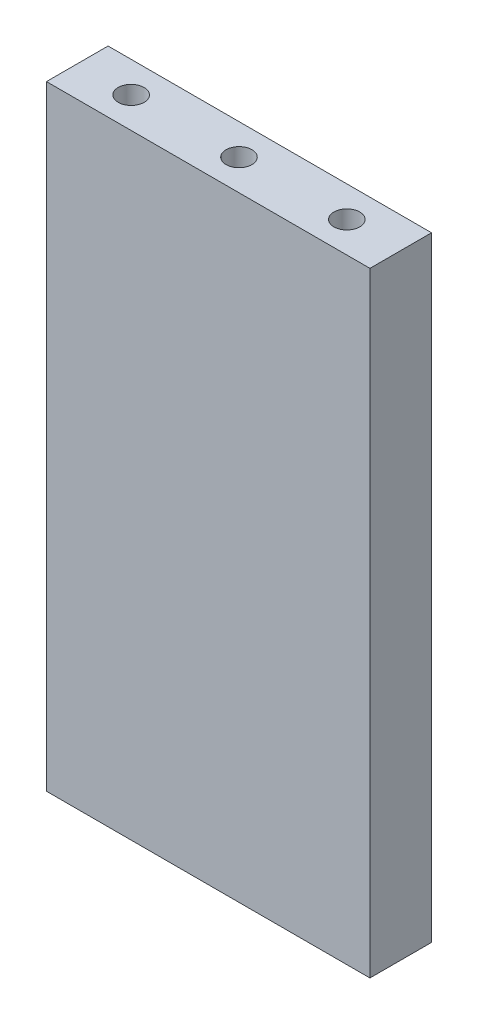
ISO-10303-21;
HEADER;
FILE_DESCRIPTION(('STEP AP214'),'2;1');
FILE_NAME('part.step','',(''),(''),'','','');
FILE_SCHEMA(('AUTOMOTIVE_DESIGN { 1 0 10303 214 1 1 1 1 }'));
ENDSEC;
DATA;
#1=APPLICATION_CONTEXT('core data for automotive mechanical design processes');
#2=APPLICATION_PROTOCOL_DEFINITION('international standard','automotive_design',2000,#1);
#3=PRODUCT_CONTEXT('',#1,'mechanical');
#4=PRODUCT('Part','Part','',(#3));
#5=PRODUCT_RELATED_PRODUCT_CATEGORY('part','',(#4));
#6=PRODUCT_DEFINITION_FORMATION('','',#4);
#7=PRODUCT_DEFINITION_CONTEXT('part definition',#1,'design');
#8=PRODUCT_DEFINITION('design','',#6,#7);
#9=PRODUCT_DEFINITION_SHAPE('','',#8);
#10=(LENGTH_UNIT() NAMED_UNIT(*) SI_UNIT(.MILLI.,.METRE.));
#11=(NAMED_UNIT(*) PLANE_ANGLE_UNIT() SI_UNIT($,.RADIAN.));
#12=(NAMED_UNIT(*) SI_UNIT($,.STERADIAN.) SOLID_ANGLE_UNIT());
#13=UNCERTAINTY_MEASURE_WITH_UNIT(LENGTH_MEASURE(1.E-05),#10,'distance_accuracy_value','');
#14=(GEOMETRIC_REPRESENTATION_CONTEXT(3) GLOBAL_UNCERTAINTY_ASSIGNED_CONTEXT((#13)) GLOBAL_UNIT_ASSIGNED_CONTEXT((#10,
#11,#12)) REPRESENTATION_CONTEXT('',''));
#15=CARTESIAN_POINT('',(0.,0.,0.));
#16=DIRECTION('',(0.,0.,1.));
#17=DIRECTION('',(1.,0.,0.));
#18=AXIS2_PLACEMENT_3D('',#15,#16,#17);
#19=CARTESIAN_POINT('',(25.,-47.5,-9.525));
#20=DIRECTION('',(1.,0.,0.));
#21=DIRECTION('',(0.,0.,-1.));
#22=AXIS2_PLACEMENT_3D('',#19,#20,#21);
#23=PLANE('',#22);
#24=DIRECTION('',(0.,1.,0.));
#25=VECTOR('',#24,1.);
#26=CARTESIAN_POINT('',(25.,-47.5,0.));
#27=LINE('',#26,#25);
#28=CARTESIAN_POINT('',(25.,-47.5,0.));
#29=VERTEX_POINT('',#28);
#30=CARTESIAN_POINT('',(25.,47.5,0.));
#31=VERTEX_POINT('',#30);
#32=EDGE_CURVE('E148',#29,#31,#27,.T.);
#33=ORIENTED_EDGE('',*,*,#32,.F.);
#34=DIRECTION('',(0.,0.,1.));
#35=VECTOR('',#34,1.);
#36=CARTESIAN_POINT('',(25.,-47.5,-9.525));
#37=LINE('',#36,#35);
#38=CARTESIAN_POINT('',(25.,-47.5,-9.525));
#39=VERTEX_POINT('',#38);
#40=EDGE_CURVE('E11',#39,#29,#37,.T.);
#41=ORIENTED_EDGE('',*,*,#40,.F.);
#42=DIRECTION('',(0.,1.,0.));
#43=VECTOR('',#42,1.);
#44=CARTESIAN_POINT('',(25.,-47.5,-9.525));
#45=LINE('',#44,#43);
#46=CARTESIAN_POINT('',(25.,47.5,-9.525));
#47=VERTEX_POINT('',#46);
#48=EDGE_CURVE('E149',#39,#47,#45,.T.);
#49=ORIENTED_EDGE('',*,*,#48,.T.);
#50=DIRECTION('',(0.,0.,1.));
#51=VECTOR('',#50,1.);
#52=CARTESIAN_POINT('',(25.,47.5,-9.525));
#53=LINE('',#52,#51);
#54=EDGE_CURVE('E42',#47,#31,#53,.T.);
#55=ORIENTED_EDGE('',*,*,#54,.T.);
#56=EDGE_LOOP('',(#33,#41,#49,#55));
#57=FACE_BOUND('',#56,.T.);
#58=ADVANCED_FACE('F39',(#57),#23,.T.);
#59=CARTESIAN_POINT('',(-25.,-47.5,-9.525));
#60=DIRECTION('',(0.,-1.,0.));
#61=DIRECTION('',(0.,0.,-1.));
#62=AXIS2_PLACEMENT_3D('',#59,#60,#61);
#63=PLANE('',#62);
#64=CARTESIAN_POINT('',(16.67,-47.5,-4.7625));
#65=DIRECTION('',(0.,-1.,0.));
#66=DIRECTION('',(0.,0.,-1.));
#67=AXIS2_PLACEMENT_3D('',#64,#65,#66);
#68=CIRCLE('',#67,1.99999999999999);
#69=CARTESIAN_POINT('',(16.67,-47.5,-6.76249999999999));
#70=VERTEX_POINT('',#69);
#71=EDGE_CURVE('E114',#70,#70,#68,.T.);
#72=ORIENTED_EDGE('',*,*,#71,.F.);
#73=EDGE_LOOP('',(#72));
#74=FACE_BOUND('',#73,.T.);
#75=CARTESIAN_POINT('',(0.,-47.5,-4.7625));
#76=DIRECTION('',(0.,-1.,0.));
#77=DIRECTION('',(0.,0.,-1.));
#78=AXIS2_PLACEMENT_3D('',#75,#76,#77);
#79=CIRCLE('',#78,1.99999999999999);
#80=CARTESIAN_POINT('',(0.,-47.5,-6.76249999999999));
#81=VERTEX_POINT('',#80);
#82=EDGE_CURVE('E113',#81,#81,#79,.T.);
#83=ORIENTED_EDGE('',*,*,#82,.F.);
#84=EDGE_LOOP('',(#83));
#85=FACE_BOUND('',#84,.T.);
#86=CARTESIAN_POINT('',(-16.67,-47.5,-4.7625));
#87=DIRECTION('',(0.,-1.,0.));
#88=DIRECTION('',(0.,0.,-1.));
#89=AXIS2_PLACEMENT_3D('',#86,#87,#88);
#90=CIRCLE('',#89,1.99999999999999);
#91=CARTESIAN_POINT('',(-16.67,-47.5,-6.76249999999999));
#92=VERTEX_POINT('',#91);
#93=EDGE_CURVE('E124',#92,#92,#90,.T.);
#94=ORIENTED_EDGE('',*,*,#93,.F.);
#95=EDGE_LOOP('',(#94));
#96=FACE_BOUND('',#95,.T.);
#97=DIRECTION('',(1.,0.,0.));
#98=VECTOR('',#97,1.);
#99=CARTESIAN_POINT('',(-25.,-47.5,0.));
#100=LINE('',#99,#98);
#101=CARTESIAN_POINT('',(-25.,-47.5,0.));
#102=VERTEX_POINT('',#101);
#103=EDGE_CURVE('E152',#102,#29,#100,.T.);
#104=ORIENTED_EDGE('',*,*,#103,.F.);
#105=DIRECTION('',(0.,0.,1.));
#106=VECTOR('',#105,1.);
#107=CARTESIAN_POINT('',(-25.,-47.5,-9.525));
#108=LINE('',#107,#106);
#109=CARTESIAN_POINT('',(-25.,-47.5,-9.525));
#110=VERTEX_POINT('',#109);
#111=EDGE_CURVE('E48',#110,#102,#108,.T.);
#112=ORIENTED_EDGE('',*,*,#111,.F.);
#113=DIRECTION('',(1.,0.,0.));
#114=VECTOR('',#113,1.);
#115=CARTESIAN_POINT('',(-25.,-47.5,-9.525));
#116=LINE('',#115,#114);
#117=EDGE_CURVE('E156',#110,#39,#116,.T.);
#118=ORIENTED_EDGE('',*,*,#117,.T.);
#119=ORIENTED_EDGE('',*,*,#40,.T.);
#120=EDGE_LOOP('',(#104,#112,#118,#119));
#121=FACE_BOUND('',#120,.T.);
#122=ADVANCED_FACE('F171',(#74,#85,#96,#121),#63,.T.);
#123=CARTESIAN_POINT('',(-25.,-47.5,-9.525));
#124=DIRECTION('',(-1.,0.,0.));
#125=DIRECTION('',(0.,0.,1.));
#126=AXIS2_PLACEMENT_3D('',#123,#124,#125);
#127=PLANE('',#126);
#128=DIRECTION('',(0.,-1.,0.));
#129=VECTOR('',#128,1.);
#130=CARTESIAN_POINT('',(-25.,-47.5,0.));
#131=LINE('',#130,#129);
#132=CARTESIAN_POINT('',(-25.,47.5,0.));
#133=VERTEX_POINT('',#132);
#134=EDGE_CURVE('E163',#133,#102,#131,.T.);
#135=ORIENTED_EDGE('',*,*,#134,.F.);
#136=DIRECTION('',(0.,0.,1.));
#137=VECTOR('',#136,1.);
#138=CARTESIAN_POINT('',(-25.,47.5,-9.525));
#139=LINE('',#138,#137);
#140=CARTESIAN_POINT('',(-25.,47.5,-9.525));
#141=VERTEX_POINT('',#140);
#142=EDGE_CURVE('E167',#141,#133,#139,.T.);
#143=ORIENTED_EDGE('',*,*,#142,.F.);
#144=DIRECTION('',(0.,-1.,0.));
#145=VECTOR('',#144,1.);
#146=CARTESIAN_POINT('',(-25.,-47.5,-9.525));
#147=LINE('',#146,#145);
#148=EDGE_CURVE('E154',#141,#110,#147,.T.);
#149=ORIENTED_EDGE('',*,*,#148,.T.);
#150=ORIENTED_EDGE('',*,*,#111,.T.);
#151=EDGE_LOOP('',(#135,#143,#149,#150));
#152=FACE_BOUND('',#151,.T.);
#153=ADVANCED_FACE('F174',(#152),#127,.T.);
#154=CARTESIAN_POINT('',(-25.,47.5,-9.525));
#155=DIRECTION('',(0.,1.,0.));
#156=DIRECTION('',(0.,0.,1.));
#157=AXIS2_PLACEMENT_3D('',#154,#155,#156);
#158=PLANE('',#157);
#159=CARTESIAN_POINT('',(0.,47.5,-4.7625));
#160=DIRECTION('',(0.,1.,0.));
#161=DIRECTION('',(0.,0.,1.));
#162=AXIS2_PLACEMENT_3D('',#159,#160,#161);
#163=CIRCLE('',#162,1.99999999999999);
#164=CARTESIAN_POINT('',(0.,47.5,-2.76250000000001));
#165=VERTEX_POINT('',#164);
#166=EDGE_CURVE('E130',#165,#165,#163,.T.);
#167=ORIENTED_EDGE('',*,*,#166,.F.);
#168=EDGE_LOOP('',(#167));
#169=FACE_BOUND('',#168,.T.);
#170=CARTESIAN_POINT('',(16.67,47.5,-4.7625));
#171=DIRECTION('',(0.,1.,0.));
#172=DIRECTION('',(0.,0.,1.));
#173=AXIS2_PLACEMENT_3D('',#170,#171,#172);
#174=CIRCLE('',#173,1.99999999999999);
#175=CARTESIAN_POINT('',(16.67,47.5,-2.76250000000001));
#176=VERTEX_POINT('',#175);
#177=EDGE_CURVE('E136',#176,#176,#174,.T.);
#178=ORIENTED_EDGE('',*,*,#177,.F.);
#179=EDGE_LOOP('',(#178));
#180=FACE_BOUND('',#179,.T.);
#181=CARTESIAN_POINT('',(-16.67,47.5,-4.7625));
#182=DIRECTION('',(0.,1.,0.));
#183=DIRECTION('',(0.,0.,1.));
#184=AXIS2_PLACEMENT_3D('',#181,#182,#183);
#185=CIRCLE('',#184,1.99999999999999);
#186=CARTESIAN_POINT('',(-16.67,47.5,-2.76250000000001));
#187=VERTEX_POINT('',#186);
#188=EDGE_CURVE('E142',#187,#187,#185,.T.);
#189=ORIENTED_EDGE('',*,*,#188,.F.);
#190=EDGE_LOOP('',(#189));
#191=FACE_BOUND('',#190,.T.);
#192=DIRECTION('',(-1.,0.,0.));
#193=VECTOR('',#192,1.);
#194=CARTESIAN_POINT('',(-25.,47.5,0.));
#195=LINE('',#194,#193);
#196=EDGE_CURVE('E160',#31,#133,#195,.T.);
#197=ORIENTED_EDGE('',*,*,#196,.F.);
#198=ORIENTED_EDGE('',*,*,#54,.F.);
#199=DIRECTION('',(-1.,0.,0.));
#200=VECTOR('',#199,1.);
#201=CARTESIAN_POINT('',(-25.,47.5,-9.525));
#202=LINE('',#201,#200);
#203=EDGE_CURVE('E151',#47,#141,#202,.T.);
#204=ORIENTED_EDGE('',*,*,#203,.T.);
#205=ORIENTED_EDGE('',*,*,#142,.T.);
#206=EDGE_LOOP('',(#197,#198,#204,#205));
#207=FACE_BOUND('',#206,.T.);
#208=ADVANCED_FACE('F168',(#169,#180,#191,#207),#158,.T.);
#209=CARTESIAN_POINT('',(0.,0.,-9.525));
#210=DIRECTION('',(0.,0.,-1.));
#211=DIRECTION('',(-1.,0.,0.));
#212=AXIS2_PLACEMENT_3D('',#209,#210,#211);
#213=PLANE('',#212);
#214=ORIENTED_EDGE('',*,*,#48,.F.);
#215=ORIENTED_EDGE('',*,*,#117,.F.);
#216=ORIENTED_EDGE('',*,*,#148,.F.);
#217=ORIENTED_EDGE('',*,*,#203,.F.);
#218=EDGE_LOOP('',(#214,#215,#216,#217));
#219=FACE_BOUND('',#218,.T.);
#220=ADVANCED_FACE('F176',(#219),#213,.T.);
#221=CARTESIAN_POINT('',(0.,0.,0.));
#222=DIRECTION('',(0.,0.,-1.));
#223=DIRECTION('',(-1.,0.,0.));
#224=AXIS2_PLACEMENT_3D('',#221,#222,#223);
#225=PLANE('',#224);
#226=ORIENTED_EDGE('',*,*,#32,.T.);
#227=ORIENTED_EDGE('',*,*,#196,.T.);
#228=ORIENTED_EDGE('',*,*,#134,.T.);
#229=ORIENTED_EDGE('',*,*,#103,.T.);
#230=EDGE_LOOP('',(#226,#227,#228,#229));
#231=FACE_BOUND('',#230,.T.);
#232=ADVANCED_FACE('F170',(#231),#225,.F.);
#233=CARTESIAN_POINT('',(-16.67,44.3,-4.7625));
#234=DIRECTION('',(0.,1.,0.));
#235=DIRECTION('',(0.,0.,1.));
#236=AXIS2_PLACEMENT_3D('',#233,#234,#235);
#237=CONICAL_SURFACE('',#236,1.99999999999999,1.02974425867665);
#238=CARTESIAN_POINT('',(-16.67,43.0982787619449,-4.7625));
#239=VERTEX_POINT('',#238);
#240=VERTEX_LOOP('',#239);
#241=FACE_BOUND('',#240,.T.);
#242=CARTESIAN_POINT('',(-16.67,44.3,-4.7625));
#243=DIRECTION('',(0.,1.,0.));
#244=DIRECTION('',(0.,0.,1.));
#245=AXIS2_PLACEMENT_3D('',#242,#243,#244);
#246=CIRCLE('',#245,1.99999999999999);
#247=CARTESIAN_POINT('',(-16.67,44.3,-2.76250000000001));
#248=VERTEX_POINT('',#247);
#249=EDGE_CURVE('E145',#248,#248,#246,.T.);
#250=ORIENTED_EDGE('',*,*,#249,.T.);
#251=EDGE_LOOP('',(#250));
#252=FACE_BOUND('',#251,.T.);
#253=ADVANCED_FACE('F183',(#241,#252),#237,.F.);
#254=CARTESIAN_POINT('',(-16.67,47.5,-4.7625));
#255=DIRECTION('',(0.,1.,0.));
#256=DIRECTION('',(0.,0.,1.));
#257=AXIS2_PLACEMENT_3D('',#254,#255,#256);
#258=CYLINDRICAL_SURFACE('',#257,1.99999999999999);
#259=ORIENTED_EDGE('',*,*,#249,.F.);
#260=EDGE_LOOP('',(#259));
#261=FACE_BOUND('',#260,.T.);
#262=ORIENTED_EDGE('',*,*,#188,.T.);
#263=EDGE_LOOP('',(#262));
#264=FACE_BOUND('',#263,.T.);
#265=ADVANCED_FACE('F235',(#261,#264),#258,.F.);
#266=CARTESIAN_POINT('',(16.67,44.3,-4.7625));
#267=DIRECTION('',(0.,1.,0.));
#268=DIRECTION('',(0.,0.,1.));
#269=AXIS2_PLACEMENT_3D('',#266,#267,#268);
#270=CONICAL_SURFACE('',#269,1.99999999999999,1.02974425867665);
#271=CARTESIAN_POINT('',(16.67,43.0982787619449,-4.7625));
#272=VERTEX_POINT('',#271);
#273=VERTEX_LOOP('',#272);
#274=FACE_BOUND('',#273,.T.);
#275=CARTESIAN_POINT('',(16.67,44.3,-4.7625));
#276=DIRECTION('',(0.,1.,0.));
#277=DIRECTION('',(0.,0.,1.));
#278=AXIS2_PLACEMENT_3D('',#275,#276,#277);
#279=CIRCLE('',#278,1.99999999999999);
#280=CARTESIAN_POINT('',(16.67,44.3,-2.76250000000001));
#281=VERTEX_POINT('',#280);
#282=EDGE_CURVE('E139',#281,#281,#279,.T.);
#283=ORIENTED_EDGE('',*,*,#282,.T.);
#284=EDGE_LOOP('',(#283));
#285=FACE_BOUND('',#284,.T.);
#286=ADVANCED_FACE('F231',(#274,#285),#270,.F.);
#287=CARTESIAN_POINT('',(16.67,47.5,-4.7625));
#288=DIRECTION('',(0.,1.,0.));
#289=DIRECTION('',(0.,0.,1.));
#290=AXIS2_PLACEMENT_3D('',#287,#288,#289);
#291=CYLINDRICAL_SURFACE('',#290,1.99999999999999);
#292=ORIENTED_EDGE('',*,*,#282,.F.);
#293=EDGE_LOOP('',(#292));
#294=FACE_BOUND('',#293,.T.);
#295=ORIENTED_EDGE('',*,*,#177,.T.);
#296=EDGE_LOOP('',(#295));
#297=FACE_BOUND('',#296,.T.);
#298=ADVANCED_FACE('F227',(#294,#297),#291,.F.);
#299=CARTESIAN_POINT('',(0.,44.3,-4.7625));
#300=DIRECTION('',(0.,1.,0.));
#301=DIRECTION('',(0.,0.,1.));
#302=AXIS2_PLACEMENT_3D('',#299,#300,#301);
#303=CONICAL_SURFACE('',#302,1.99999999999999,1.02974425867665);
#304=CARTESIAN_POINT('',(0.,43.0982787619449,-4.7625));
#305=VERTEX_POINT('',#304);
#306=VERTEX_LOOP('',#305);
#307=FACE_BOUND('',#306,.T.);
#308=CARTESIAN_POINT('',(0.,44.3,-4.7625));
#309=DIRECTION('',(0.,1.,0.));
#310=DIRECTION('',(0.,0.,1.));
#311=AXIS2_PLACEMENT_3D('',#308,#309,#310);
#312=CIRCLE('',#311,1.99999999999999);
#313=CARTESIAN_POINT('',(0.,44.3,-2.76250000000001));
#314=VERTEX_POINT('',#313);
#315=EDGE_CURVE('E133',#314,#314,#312,.T.);
#316=ORIENTED_EDGE('',*,*,#315,.T.);
#317=EDGE_LOOP('',(#316));
#318=FACE_BOUND('',#317,.T.);
#319=ADVANCED_FACE('F223',(#307,#318),#303,.F.);
#320=CARTESIAN_POINT('',(0.,47.5,-4.7625));
#321=DIRECTION('',(0.,1.,0.));
#322=DIRECTION('',(0.,0.,1.));
#323=AXIS2_PLACEMENT_3D('',#320,#321,#322);
#324=CYLINDRICAL_SURFACE('',#323,1.99999999999999);
#325=ORIENTED_EDGE('',*,*,#315,.F.);
#326=EDGE_LOOP('',(#325));
#327=FACE_BOUND('',#326,.T.);
#328=ORIENTED_EDGE('',*,*,#166,.T.);
#329=EDGE_LOOP('',(#328));
#330=FACE_BOUND('',#329,.T.);
#331=ADVANCED_FACE('F216',(#327,#330),#324,.F.);
#332=CARTESIAN_POINT('',(-16.67,-44.3,-4.7625));
#333=DIRECTION('',(0.,-1.,0.));
#334=DIRECTION('',(0.,0.,-1.));
#335=AXIS2_PLACEMENT_3D('',#332,#333,#334);
#336=CONICAL_SURFACE('',#335,1.99999999999999,1.02974425867665);
#337=CARTESIAN_POINT('',(-16.67,-43.0982787619449,-4.7625));
#338=VERTEX_POINT('',#337);
#339=VERTEX_LOOP('',#338);
#340=FACE_BOUND('',#339,.T.);
#341=CARTESIAN_POINT('',(-16.67,-44.3,-4.7625));
#342=DIRECTION('',(0.,-1.,0.));
#343=DIRECTION('',(0.,0.,-1.));
#344=AXIS2_PLACEMENT_3D('',#341,#342,#343);
#345=CIRCLE('',#344,1.99999999999999);
#346=CARTESIAN_POINT('',(-16.67,-44.3,-6.76249999999999));
#347=VERTEX_POINT('',#346);
#348=EDGE_CURVE('E127',#347,#347,#345,.T.);
#349=ORIENTED_EDGE('',*,*,#348,.T.);
#350=EDGE_LOOP('',(#349));
#351=FACE_BOUND('',#350,.T.);
#352=ADVANCED_FACE('F208',(#340,#351),#336,.F.);
#353=CARTESIAN_POINT('',(-16.67,-47.5,-4.7625));
#354=DIRECTION('',(0.,-1.,0.));
#355=DIRECTION('',(0.,0.,-1.));
#356=AXIS2_PLACEMENT_3D('',#353,#354,#355);
#357=CYLINDRICAL_SURFACE('',#356,1.99999999999999);
#358=ORIENTED_EDGE('',*,*,#348,.F.);
#359=EDGE_LOOP('',(#358));
#360=FACE_BOUND('',#359,.T.);
#361=ORIENTED_EDGE('',*,*,#93,.T.);
#362=EDGE_LOOP('',(#361));
#363=FACE_BOUND('',#362,.T.);
#364=ADVANCED_FACE('F205',(#360,#363),#357,.F.);
#365=CARTESIAN_POINT('',(0.,-44.3,-4.7625));
#366=DIRECTION('',(0.,-1.,0.));
#367=DIRECTION('',(0.,0.,-1.));
#368=AXIS2_PLACEMENT_3D('',#365,#366,#367);
#369=CONICAL_SURFACE('',#368,1.99999999999999,1.02974425867665);
#370=CARTESIAN_POINT('',(0.,-43.0982787619449,-4.7625));
#371=VERTEX_POINT('',#370);
#372=VERTEX_LOOP('',#371);
#373=FACE_BOUND('',#372,.T.);
#374=CARTESIAN_POINT('',(0.,-44.3,-4.7625));
#375=DIRECTION('',(0.,-1.,0.));
#376=DIRECTION('',(0.,0.,-1.));
#377=AXIS2_PLACEMENT_3D('',#374,#375,#376);
#378=CIRCLE('',#377,1.99999999999999);
#379=CARTESIAN_POINT('',(0.,-44.3,-6.76249999999999));
#380=VERTEX_POINT('',#379);
#381=EDGE_CURVE('E117',#380,#380,#378,.T.);
#382=ORIENTED_EDGE('',*,*,#381,.T.);
#383=EDGE_LOOP('',(#382));
#384=FACE_BOUND('',#383,.T.);
#385=ADVANCED_FACE('F207',(#373,#384),#369,.F.);
#386=CARTESIAN_POINT('',(0.,-47.5,-4.7625));
#387=DIRECTION('',(0.,-1.,0.));
#388=DIRECTION('',(0.,0.,-1.));
#389=AXIS2_PLACEMENT_3D('',#386,#387,#388);
#390=CYLINDRICAL_SURFACE('',#389,1.99999999999999);
#391=ORIENTED_EDGE('',*,*,#381,.F.);
#392=EDGE_LOOP('',(#391));
#393=FACE_BOUND('',#392,.T.);
#394=ORIENTED_EDGE('',*,*,#82,.T.);
#395=EDGE_LOOP('',(#394));
#396=FACE_BOUND('',#395,.T.);
#397=ADVANCED_FACE('F107',(#393,#396),#390,.F.);
#398=CARTESIAN_POINT('',(16.67,-44.3,-4.7625));
#399=DIRECTION('',(0.,-1.,0.));
#400=DIRECTION('',(0.,0.,-1.));
#401=AXIS2_PLACEMENT_3D('',#398,#399,#400);
#402=CONICAL_SURFACE('',#401,1.99999999999999,1.02974425867665);
#403=CARTESIAN_POINT('',(16.67,-43.0982787619449,-4.7625));
#404=VERTEX_POINT('',#403);
#405=VERTEX_LOOP('',#404);
#406=FACE_BOUND('',#405,.T.);
#407=CARTESIAN_POINT('',(16.67,-44.3,-4.7625));
#408=DIRECTION('',(0.,-1.,0.));
#409=DIRECTION('',(0.,0.,-1.));
#410=AXIS2_PLACEMENT_3D('',#407,#408,#409);
#411=CIRCLE('',#410,1.99999999999999);
#412=CARTESIAN_POINT('',(16.67,-44.3,-6.76249999999999));
#413=VERTEX_POINT('',#412);
#414=EDGE_CURVE('E111',#413,#413,#411,.T.);
#415=ORIENTED_EDGE('',*,*,#414,.T.);
#416=EDGE_LOOP('',(#415));
#417=FACE_BOUND('',#416,.T.);
#418=ADVANCED_FACE('F103',(#406,#417),#402,.F.);
#419=CARTESIAN_POINT('',(16.67,-47.5,-4.7625));
#420=DIRECTION('',(0.,-1.,0.));
#421=DIRECTION('',(0.,0.,-1.));
#422=AXIS2_PLACEMENT_3D('',#419,#420,#421);
#423=CYLINDRICAL_SURFACE('',#422,1.99999999999999);
#424=ORIENTED_EDGE('',*,*,#414,.F.);
#425=EDGE_LOOP('',(#424));
#426=FACE_BOUND('',#425,.T.);
#427=ORIENTED_EDGE('',*,*,#71,.T.);
#428=EDGE_LOOP('',(#427));
#429=FACE_BOUND('',#428,.T.);
#430=ADVANCED_FACE('F106',(#426,#429),#423,.F.);
#431=CLOSED_SHELL('',(#58,#122,#153,#208,#220,#232,#253,#265,#286,#298,#319,#331,#352,#364,#385,
#397,#418,#430));
#432=MANIFOLD_SOLID_BREP('B2',#431);
#433=ADVANCED_BREP_SHAPE_REPRESENTATION('',(#18,#432),#14);
#434=SHAPE_DEFINITION_REPRESENTATION(#9,#433);
ENDSEC;
END-ISO-10303-21;
